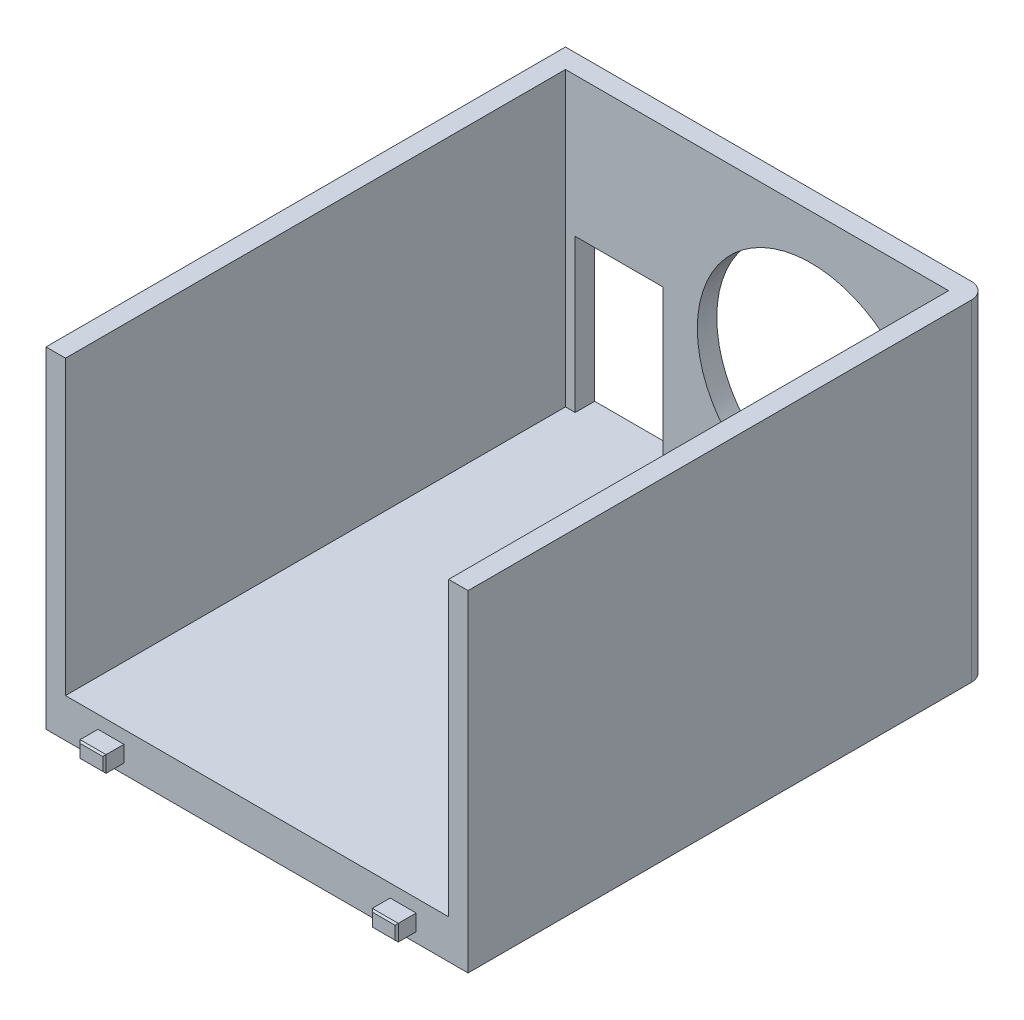
ISO-10303-21;
HEADER;
FILE_DESCRIPTION(('STEP AP214'),'2;1');
FILE_NAME('part.step','',(''),(''),'','','');
FILE_SCHEMA(('AUTOMOTIVE_DESIGN { 1 0 10303 214 1 1 1 1 }'));
ENDSEC;
DATA;
#1=APPLICATION_CONTEXT('core data for automotive mechanical design processes');
#2=APPLICATION_PROTOCOL_DEFINITION('international standard','automotive_design',2000,#1);
#3=PRODUCT_CONTEXT('',#1,'mechanical');
#4=PRODUCT('Part','Part','',(#3));
#5=PRODUCT_RELATED_PRODUCT_CATEGORY('part','',(#4));
#6=PRODUCT_DEFINITION_FORMATION('','',#4);
#7=PRODUCT_DEFINITION_CONTEXT('part definition',#1,'design');
#8=PRODUCT_DEFINITION('design','',#6,#7);
#9=PRODUCT_DEFINITION_SHAPE('','',#8);
#10=(LENGTH_UNIT() NAMED_UNIT(*) SI_UNIT(.MILLI.,.METRE.));
#11=(NAMED_UNIT(*) PLANE_ANGLE_UNIT() SI_UNIT($,.RADIAN.));
#12=(NAMED_UNIT(*) SI_UNIT($,.STERADIAN.) SOLID_ANGLE_UNIT());
#13=UNCERTAINTY_MEASURE_WITH_UNIT(LENGTH_MEASURE(1.E-05),#10,'distance_accuracy_value','');
#14=(GEOMETRIC_REPRESENTATION_CONTEXT(3) GLOBAL_UNCERTAINTY_ASSIGNED_CONTEXT((#13)) GLOBAL_UNIT_ASSIGNED_CONTEXT((#10,
#11,#12)) REPRESENTATION_CONTEXT('',''));
#15=CARTESIAN_POINT('',(0.,0.,0.));
#16=DIRECTION('',(0.,0.,1.));
#17=DIRECTION('',(1.,0.,0.));
#18=AXIS2_PLACEMENT_3D('',#15,#16,#17);
#19=CARTESIAN_POINT('',(9.,20.,90.));
#20=DIRECTION('',(-1.,0.,0.));
#21=DIRECTION('',(0.,-1.,0.));
#22=AXIS2_PLACEMENT_3D('',#19,#20,#21);
#23=PLANE('',#22);
#24=DIRECTION('',(0.,0.,-1.));
#25=VECTOR('',#24,1.);
#26=CARTESIAN_POINT('',(9.,59.,34.1602556806575));
#27=LINE('',#26,#25);
#28=CARTESIAN_POINT('',(9.,59.,6.));
#29=VERTEX_POINT('',#28);
#30=CARTESIAN_POINT('',(9.,59.,0.));
#31=VERTEX_POINT('',#30);
#32=EDGE_CURVE('E228',#29,#31,#27,.T.);
#33=ORIENTED_EDGE('',*,*,#32,.F.);
#34=DIRECTION('',(0.,1.,0.));
#35=VECTOR('',#34,1.);
#36=CARTESIAN_POINT('',(9.00000000000001,102.,6.));
#37=LINE('',#36,#35);
#38=CARTESIAN_POINT('',(9.,12.,6.));
#39=VERTEX_POINT('',#38);
#40=EDGE_CURVE('E261',#39,#29,#37,.T.);
#41=ORIENTED_EDGE('',*,*,#40,.F.);
#42=DIRECTION('',(0.,0.,-1.));
#43=VECTOR('',#42,1.);
#44=CARTESIAN_POINT('',(9.,12.,10.));
#45=LINE('',#44,#43);
#46=CARTESIAN_POINT('',(9.,12.,0.));
#47=VERTEX_POINT('',#46);
#48=EDGE_CURVE('E247',#39,#47,#45,.T.);
#49=ORIENTED_EDGE('',*,*,#48,.T.);
#50=DIRECTION('',(0.,1.,0.));
#51=VECTOR('',#50,1.);
#52=CARTESIAN_POINT('',(9.,20.,0.));
#53=LINE('',#52,#51);
#54=EDGE_CURVE('E245',#47,#31,#53,.T.);
#55=ORIENTED_EDGE('',*,*,#54,.T.);
#56=EDGE_LOOP('',(#33,#41,#49,#55));
#57=FACE_BOUND('',#56,.T.);
#58=ADVANCED_FACE('F41',(#57),#23,.F.);
#59=CARTESIAN_POINT('',(0.,12.,0.));
#60=DIRECTION('',(0.,0.,1.));
#61=DIRECTION('',(1.,0.,0.));
#62=AXIS2_PLACEMENT_3D('',#59,#60,#61);
#63=PLANE('',#62);
#64=DIRECTION('',(0.,-1.,0.));
#65=VECTOR('',#64,1.);
#66=CARTESIAN_POINT('',(36.,67.,0.));
#67=LINE('',#66,#65);
#68=CARTESIAN_POINT('',(36.,59.,0.));
#69=VERTEX_POINT('',#68);
#70=CARTESIAN_POINT('',(36.,12.,0.));
#71=VERTEX_POINT('',#70);
#72=EDGE_CURVE('E243',#69,#71,#67,.T.);
#73=ORIENTED_EDGE('',*,*,#72,.F.);
#74=DIRECTION('',(-1.,0.,0.));
#75=VECTOR('',#74,1.);
#76=CARTESIAN_POINT('',(36.,59.,0.));
#77=LINE('',#76,#75);
#78=EDGE_CURVE('E57',#69,#31,#77,.T.);
#79=ORIENTED_EDGE('',*,*,#78,.T.);
#80=ORIENTED_EDGE('',*,*,#54,.F.);
#81=DIRECTION('',(-1.,0.,0.));
#82=VECTOR('',#81,1.);
#83=CARTESIAN_POINT('',(36.,12.,0.));
#84=LINE('',#83,#82);
#85=EDGE_CURVE('E556',#71,#47,#84,.T.);
#86=ORIENTED_EDGE('',*,*,#85,.F.);
#87=EDGE_LOOP('',(#73,#79,#80,#86));
#88=FACE_BOUND('',#87,.T.);
#89=DIRECTION('',(-1.,0.,0.));
#90=VECTOR('',#89,1.);
#91=CARTESIAN_POINT('',(0.,102.,0.));
#92=LINE('',#91,#90);
#93=CARTESIAN_POINT('',(125.,102.,0.));
#94=VERTEX_POINT('',#93);
#95=CARTESIAN_POINT('',(0.,102.,0.));
#96=VERTEX_POINT('',#95);
#97=EDGE_CURVE('E295',#94,#96,#92,.T.);
#98=ORIENTED_EDGE('',*,*,#97,.F.);
#99=DIRECTION('',(0.,-1.,0.));
#100=VECTOR('',#99,1.);
#101=CARTESIAN_POINT('',(125.,12.,0.));
#102=LINE('',#101,#100);
#103=CARTESIAN_POINT('',(125.,0.,0.));
#104=VERTEX_POINT('',#103);
#105=EDGE_CURVE('E343',#94,#104,#102,.T.);
#106=ORIENTED_EDGE('',*,*,#105,.T.);
#107=DIRECTION('',(-1.,0.,0.));
#108=VECTOR('',#107,1.);
#109=CARTESIAN_POINT('',(0.,0.,0.));
#110=LINE('',#109,#108);
#111=CARTESIAN_POINT('',(0.,0.,0.));
#112=VERTEX_POINT('',#111);
#113=EDGE_CURVE('E291',#104,#112,#110,.T.);
#114=ORIENTED_EDGE('',*,*,#113,.T.);
#115=DIRECTION('',(0.,-1.,0.));
#116=VECTOR('',#115,1.);
#117=CARTESIAN_POINT('',(0.,12.,0.));
#118=LINE('',#117,#116);
#119=EDGE_CURVE('E509',#96,#112,#118,.T.);
#120=ORIENTED_EDGE('',*,*,#119,.F.);
#121=EDGE_LOOP('',(#98,#106,#114,#120));
#122=FACE_BOUND('',#121,.T.);
#123=CARTESIAN_POINT('',(81.5989299169716,53.2029572000968,0.));
#124=DIRECTION('',(0.,0.,-1.));
#125=DIRECTION('',(-1.,0.,0.));
#126=AXIS2_PLACEMENT_3D('',#123,#124,#125);
#127=CIRCLE('',#126,35.);
#128=CARTESIAN_POINT('',(46.5989299169716,53.2029572000968,0.));
#129=VERTEX_POINT('',#128);
#130=EDGE_CURVE('E249',#129,#129,#127,.T.);
#131=ORIENTED_EDGE('',*,*,#130,.F.);
#132=EDGE_LOOP('',(#131));
#133=FACE_BOUND('',#132,.T.);
#134=ADVANCED_FACE('F238',(#88,#122,#133),#63,.F.);
#135=CARTESIAN_POINT('',(0.,0.,160.));
#136=DIRECTION('',(0.,0.,1.));
#137=DIRECTION('',(1.,0.,0.));
#138=AXIS2_PLACEMENT_3D('',#135,#136,#137);
#139=PLANE('',#138);
#140=DIRECTION('',(-1.,0.,0.));
#141=VECTOR('',#140,1.);
#142=CARTESIAN_POINT('',(24.,8.,160.));
#143=LINE('',#142,#141);
#144=CARTESIAN_POINT('',(24.,8.,160.));
#145=VERTEX_POINT('',#144);
#146=CARTESIAN_POINT('',(16.,8.,160.));
#147=VERTEX_POINT('',#146);
#148=EDGE_CURVE('E522',#145,#147,#143,.T.);
#149=ORIENTED_EDGE('',*,*,#148,.F.);
#150=DIRECTION('',(0.,1.,0.));
#151=VECTOR('',#150,1.);
#152=CARTESIAN_POINT('',(24.,8.,160.));
#153=LINE('',#152,#151);
#154=CARTESIAN_POINT('',(24.,3.,160.));
#155=VERTEX_POINT('',#154);
#156=EDGE_CURVE('E550',#155,#145,#153,.T.);
#157=ORIENTED_EDGE('',*,*,#156,.F.);
#158=DIRECTION('',(1.,0.,0.));
#159=VECTOR('',#158,1.);
#160=CARTESIAN_POINT('',(16.,3.,160.));
#161=LINE('',#160,#159);
#162=CARTESIAN_POINT('',(16.,3.,160.));
#163=VERTEX_POINT('',#162);
#164=EDGE_CURVE('E549',#163,#155,#161,.T.);
#165=ORIENTED_EDGE('',*,*,#164,.F.);
#166=DIRECTION('',(0.,-1.,0.));
#167=VECTOR('',#166,1.);
#168=CARTESIAN_POINT('',(16.,8.,160.));
#169=LINE('',#168,#167);
#170=EDGE_CURVE('E554',#147,#163,#169,.T.);
#171=ORIENTED_EDGE('',*,*,#170,.F.);
#172=EDGE_LOOP('',(#149,#157,#165,#171));
#173=FACE_BOUND('',#172,.T.);
#174=DIRECTION('',(-1.,0.,0.));
#175=VECTOR('',#174,1.);
#176=CARTESIAN_POINT('',(114.,8.,160.));
#177=LINE('',#176,#175);
#178=CARTESIAN_POINT('',(114.,8.,160.));
#179=VERTEX_POINT('',#178);
#180=CARTESIAN_POINT('',(106.,8.,160.));
#181=VERTEX_POINT('',#180);
#182=EDGE_CURVE('E518',#179,#181,#177,.T.);
#183=ORIENTED_EDGE('',*,*,#182,.F.);
#184=DIRECTION('',(0.,1.,0.));
#185=VECTOR('',#184,1.);
#186=CARTESIAN_POINT('',(114.,3.,160.));
#187=LINE('',#186,#185);
#188=CARTESIAN_POINT('',(114.,3.,160.));
#189=VERTEX_POINT('',#188);
#190=EDGE_CURVE('E529',#189,#179,#187,.T.);
#191=ORIENTED_EDGE('',*,*,#190,.F.);
#192=DIRECTION('',(1.,0.,0.));
#193=VECTOR('',#192,1.);
#194=CARTESIAN_POINT('',(106.,3.,160.));
#195=LINE('',#194,#193);
#196=CARTESIAN_POINT('',(106.,3.,160.));
#197=VERTEX_POINT('',#196);
#198=EDGE_CURVE('E527',#197,#189,#195,.T.);
#199=ORIENTED_EDGE('',*,*,#198,.F.);
#200=DIRECTION('',(0.,-1.,0.));
#201=VECTOR('',#200,1.);
#202=CARTESIAN_POINT('',(106.,8.,160.));
#203=LINE('',#202,#201);
#204=EDGE_CURVE('E523',#181,#197,#203,.T.);
#205=ORIENTED_EDGE('',*,*,#204,.F.);
#206=EDGE_LOOP('',(#183,#191,#199,#205));
#207=FACE_BOUND('',#206,.T.);
#208=DIRECTION('',(0.,1.,0.));
#209=VECTOR('',#208,1.);
#210=CARTESIAN_POINT('',(130.,12.,160.));
#211=LINE('',#210,#209);
#212=CARTESIAN_POINT('',(130.,0.,160.));
#213=VERTEX_POINT('',#212);
#214=CARTESIAN_POINT('',(130.,102.,160.));
#215=VERTEX_POINT('',#214);
#216=EDGE_CURVE('E271',#213,#215,#211,.T.);
#217=ORIENTED_EDGE('',*,*,#216,.T.);
#218=DIRECTION('',(-1.,0.,0.));
#219=VECTOR('',#218,1.);
#220=CARTESIAN_POINT('',(0.,102.,160.));
#221=LINE('',#220,#219);
#222=CARTESIAN_POINT('',(124.,102.,160.));
#223=VERTEX_POINT('',#222);
#224=EDGE_CURVE('E280',#215,#223,#221,.T.);
#225=ORIENTED_EDGE('',*,*,#224,.T.);
#226=DIRECTION('',(0.,-1.,0.));
#227=VECTOR('',#226,1.);
#228=CARTESIAN_POINT('',(124.,102.,160.));
#229=LINE('',#228,#227);
#230=CARTESIAN_POINT('',(124.,12.,160.));
#231=VERTEX_POINT('',#230);
#232=EDGE_CURVE('E273',#223,#231,#229,.T.);
#233=ORIENTED_EDGE('',*,*,#232,.T.);
#234=DIRECTION('',(-1.,0.,0.));
#235=VECTOR('',#234,1.);
#236=CARTESIAN_POINT('',(0.,12.,160.));
#237=LINE('',#236,#235);
#238=CARTESIAN_POINT('',(5.99999999999999,12.,160.));
#239=VERTEX_POINT('',#238);
#240=EDGE_CURVE('E265',#231,#239,#237,.T.);
#241=ORIENTED_EDGE('',*,*,#240,.T.);
#242=DIRECTION('',(0.,1.,0.));
#243=VECTOR('',#242,1.);
#244=CARTESIAN_POINT('',(5.99999999999999,102.,160.));
#245=LINE('',#244,#243);
#246=CARTESIAN_POINT('',(5.99999999999999,102.,160.));
#247=VERTEX_POINT('',#246);
#248=EDGE_CURVE('E264',#239,#247,#245,.T.);
#249=ORIENTED_EDGE('',*,*,#248,.T.);
#250=CARTESIAN_POINT('',(0.,102.,160.));
#251=VERTEX_POINT('',#250);
#252=EDGE_CURVE('E279',#247,#251,#221,.T.);
#253=ORIENTED_EDGE('',*,*,#252,.T.);
#254=DIRECTION('',(0.,-1.,0.));
#255=VECTOR('',#254,1.);
#256=CARTESIAN_POINT('',(0.,12.,160.));
#257=LINE('',#256,#255);
#258=CARTESIAN_POINT('',(0.,0.,160.));
#259=VERTEX_POINT('',#258);
#260=EDGE_CURVE('E268',#251,#259,#257,.T.);
#261=ORIENTED_EDGE('',*,*,#260,.T.);
#262=DIRECTION('',(-1.,0.,0.));
#263=VECTOR('',#262,1.);
#264=CARTESIAN_POINT('',(0.,0.,160.));
#265=LINE('',#264,#263);
#266=EDGE_CURVE('E259',#213,#259,#265,.T.);
#267=ORIENTED_EDGE('',*,*,#266,.F.);
#268=EDGE_LOOP('',(#217,#225,#233,#241,#249,#253,#261,#267));
#269=FACE_BOUND('',#268,.T.);
#270=ADVANCED_FACE('F435',(#173,#207,#269),#139,.T.);
#271=CARTESIAN_POINT('',(0.,12.,0.));
#272=DIRECTION('',(0.,-1.,0.));
#273=DIRECTION('',(0.,0.,-1.));
#274=AXIS2_PLACEMENT_3D('',#271,#272,#273);
#275=PLANE('',#274);
#276=DIRECTION('',(1.,0.,0.));
#277=VECTOR('',#276,1.);
#278=CARTESIAN_POINT('',(124.,12.,5.99999999999999));
#279=LINE('',#278,#277);
#280=CARTESIAN_POINT('',(36.,12.,6.));
#281=VERTEX_POINT('',#280);
#282=CARTESIAN_POINT('',(124.,12.,5.99999999999999));
#283=VERTEX_POINT('',#282);
#284=EDGE_CURVE('E413',#281,#283,#279,.T.);
#285=ORIENTED_EDGE('',*,*,#284,.F.);
#286=DIRECTION('',(0.,0.,-1.));
#287=VECTOR('',#286,1.);
#288=CARTESIAN_POINT('',(36.,12.,10.));
#289=LINE('',#288,#287);
#290=EDGE_CURVE('E508',#281,#71,#289,.T.);
#291=ORIENTED_EDGE('',*,*,#290,.T.);
#292=ORIENTED_EDGE('',*,*,#85,.T.);
#293=ORIENTED_EDGE('',*,*,#48,.F.);
#294=CARTESIAN_POINT('',(5.99999999999999,12.,6.));
#295=VERTEX_POINT('',#294);
#296=EDGE_CURVE('E415',#295,#39,#279,.T.);
#297=ORIENTED_EDGE('',*,*,#296,.F.);
#298=DIRECTION('',(0.,0.,-1.));
#299=VECTOR('',#298,1.);
#300=CARTESIAN_POINT('',(5.99999999999997,12.,0.));
#301=LINE('',#300,#299);
#302=EDGE_CURVE('E296',#239,#295,#301,.T.);
#303=ORIENTED_EDGE('',*,*,#302,.F.);
#304=ORIENTED_EDGE('',*,*,#240,.F.);
#305=DIRECTION('',(0.,0.,1.));
#306=VECTOR('',#305,1.);
#307=CARTESIAN_POINT('',(124.,12.,0.));
#308=LINE('',#307,#306);
#309=EDGE_CURVE('E301',#283,#231,#308,.T.);
#310=ORIENTED_EDGE('',*,*,#309,.F.);
#311=EDGE_LOOP('',(#285,#291,#292,#293,#297,#303,#304,#310));
#312=FACE_BOUND('',#311,.T.);
#313=ADVANCED_FACE('F428',(#312),#275,.F.);
#314=CARTESIAN_POINT('',(5.99999999999997,102.,0.));
#315=DIRECTION('',(-1.,0.,0.));
#316=DIRECTION('',(0.,0.,1.));
#317=AXIS2_PLACEMENT_3D('',#314,#315,#316);
#318=PLANE('',#317);
#319=ORIENTED_EDGE('',*,*,#248,.F.);
#320=ORIENTED_EDGE('',*,*,#302,.T.);
#321=DIRECTION('',(0.,-1.,0.));
#322=VECTOR('',#321,1.);
#323=CARTESIAN_POINT('',(5.99999999999999,102.,6.));
#324=LINE('',#323,#322);
#325=CARTESIAN_POINT('',(5.99999999999997,102.,5.99999999999999));
#326=VERTEX_POINT('',#325);
#327=EDGE_CURVE('E306',#326,#295,#324,.T.);
#328=ORIENTED_EDGE('',*,*,#327,.F.);
#329=DIRECTION('',(0.,0.,-1.));
#330=VECTOR('',#329,1.);
#331=CARTESIAN_POINT('',(5.99999999999997,102.,0.));
#332=LINE('',#331,#330);
#333=EDGE_CURVE('E294',#247,#326,#332,.T.);
#334=ORIENTED_EDGE('',*,*,#333,.F.);
#335=EDGE_LOOP('',(#319,#320,#328,#334));
#336=FACE_BOUND('',#335,.T.);
#337=ADVANCED_FACE('F497',(#336),#318,.F.);
#338=CARTESIAN_POINT('',(0.,12.,250.));
#339=DIRECTION('',(1.,0.,0.));
#340=DIRECTION('',(0.,0.,-1.));
#341=AXIS2_PLACEMENT_3D('',#338,#339,#340);
#342=PLANE('',#341);
#343=ORIENTED_EDGE('',*,*,#260,.F.);
#344=DIRECTION('',(0.,0.,1.));
#345=VECTOR('',#344,1.);
#346=CARTESIAN_POINT('',(0.,102.,320.));
#347=LINE('',#346,#345);
#348=EDGE_CURVE('E289',#96,#251,#347,.T.);
#349=ORIENTED_EDGE('',*,*,#348,.F.);
#350=ORIENTED_EDGE('',*,*,#119,.T.);
#351=DIRECTION('',(0.,0.,1.));
#352=VECTOR('',#351,1.);
#353=CARTESIAN_POINT('',(0.,0.,0.));
#354=LINE('',#353,#352);
#355=CARTESIAN_POINT('',(0.,0.,70.));
#356=VERTEX_POINT('',#355);
#357=EDGE_CURVE('E386',#112,#356,#354,.T.);
#358=ORIENTED_EDGE('',*,*,#357,.T.);
#359=DIRECTION('',(0.,-1.,0.));
#360=VECTOR('',#359,1.);
#361=CARTESIAN_POINT('',(0.,12.,70.));
#362=LINE('',#361,#360);
#363=CARTESIAN_POINT('',(0.,12.,70.));
#364=VERTEX_POINT('',#363);
#365=EDGE_CURVE('E459',#364,#356,#362,.T.);
#366=ORIENTED_EDGE('',*,*,#365,.F.);
#367=DIRECTION('',(0.,0.,1.));
#368=VECTOR('',#367,1.);
#369=CARTESIAN_POINT('',(0.,12.,320.));
#370=LINE('',#369,#368);
#371=CARTESIAN_POINT('',(0.,12.,90.));
#372=VERTEX_POINT('',#371);
#373=EDGE_CURVE('E297',#364,#372,#370,.T.);
#374=ORIENTED_EDGE('',*,*,#373,.T.);
#375=DIRECTION('',(0.,-1.,0.));
#376=VECTOR('',#375,1.);
#377=CARTESIAN_POINT('',(0.,12.,90.));
#378=LINE('',#377,#376);
#379=CARTESIAN_POINT('',(0.,0.,90.));
#380=VERTEX_POINT('',#379);
#381=EDGE_CURVE('E399',#372,#380,#378,.T.);
#382=ORIENTED_EDGE('',*,*,#381,.T.);
#383=DIRECTION('',(0.,0.,1.));
#384=VECTOR('',#383,1.);
#385=CARTESIAN_POINT('',(0.,0.,90.));
#386=LINE('',#385,#384);
#387=EDGE_CURVE('E283',#380,#259,#386,.T.);
#388=ORIENTED_EDGE('',*,*,#387,.T.);
#389=EDGE_LOOP('',(#343,#349,#350,#358,#366,#374,#382,#388));
#390=FACE_BOUND('',#389,.T.);
#391=ADVANCED_FACE('F439',(#390),#342,.F.);
#392=CARTESIAN_POINT('',(130.,12.,0.));
#393=DIRECTION('',(-1.,0.,0.));
#394=DIRECTION('',(0.,0.,1.));
#395=AXIS2_PLACEMENT_3D('',#392,#393,#394);
#396=PLANE('',#395);
#397=DIRECTION('',(0.,0.,-1.));
#398=VECTOR('',#397,1.);
#399=CARTESIAN_POINT('',(130.,0.,0.));
#400=LINE('',#399,#398);
#401=CARTESIAN_POINT('',(130.,0.,5.));
#402=VERTEX_POINT('',#401);
#403=EDGE_CURVE('E284',#213,#402,#400,.T.);
#404=ORIENTED_EDGE('',*,*,#403,.T.);
#405=DIRECTION('',(0.,-1.,0.));
#406=VECTOR('',#405,1.);
#407=CARTESIAN_POINT('',(130.,12.,5.));
#408=LINE('',#407,#406);
#409=CARTESIAN_POINT('',(130.,102.,5.));
#410=VERTEX_POINT('',#409);
#411=EDGE_CURVE('E47',#402,#410,#408,.F.);
#412=ORIENTED_EDGE('',*,*,#411,.T.);
#413=DIRECTION('',(0.,0.,-1.));
#414=VECTOR('',#413,1.);
#415=CARTESIAN_POINT('',(130.,102.,320.));
#416=LINE('',#415,#414);
#417=EDGE_CURVE('E302',#215,#410,#416,.T.);
#418=ORIENTED_EDGE('',*,*,#417,.F.);
#419=ORIENTED_EDGE('',*,*,#216,.F.);
#420=EDGE_LOOP('',(#404,#412,#418,#419));
#421=FACE_BOUND('',#420,.T.);
#422=ADVANCED_FACE('F371',(#421),#396,.F.);
#423=CARTESIAN_POINT('',(0.,0.,0.));
#424=DIRECTION('',(0.,-1.,0.));
#425=DIRECTION('',(0.,0.,-1.));
#426=AXIS2_PLACEMENT_3D('',#423,#424,#425);
#427=PLANE('',#426);
#428=ORIENTED_EDGE('',*,*,#113,.F.);
#429=CARTESIAN_POINT('',(125.,0.,5.));
#430=DIRECTION('',(0.,-1.,0.));
#431=DIRECTION('',(0.,0.,-1.));
#432=AXIS2_PLACEMENT_3D('',#429,#430,#431);
#433=CIRCLE('',#432,5.);
#434=EDGE_CURVE('E366',#104,#402,#433,.T.);
#435=ORIENTED_EDGE('',*,*,#434,.T.);
#436=ORIENTED_EDGE('',*,*,#403,.F.);
#437=ORIENTED_EDGE('',*,*,#266,.T.);
#438=ORIENTED_EDGE('',*,*,#387,.F.);
#439=DIRECTION('',(-1.,0.,0.));
#440=VECTOR('',#439,1.);
#441=CARTESIAN_POINT('',(4.00000000000001,0.,90.));
#442=LINE('',#441,#440);
#443=CARTESIAN_POINT('',(4.00000000000001,0.,90.));
#444=VERTEX_POINT('',#443);
#445=EDGE_CURVE('E288',#444,#380,#442,.T.);
#446=ORIENTED_EDGE('',*,*,#445,.F.);
#447=DIRECTION('',(0.,0.,1.));
#448=VECTOR('',#447,1.);
#449=CARTESIAN_POINT('',(4.00000000000001,0.,70.));
#450=LINE('',#449,#448);
#451=CARTESIAN_POINT('',(4.00000000000001,0.,70.));
#452=VERTEX_POINT('',#451);
#453=EDGE_CURVE('E455',#452,#444,#450,.T.);
#454=ORIENTED_EDGE('',*,*,#453,.F.);
#455=DIRECTION('',(1.,0.,0.));
#456=VECTOR('',#455,1.);
#457=CARTESIAN_POINT('',(0.,0.,70.));
#458=LINE('',#457,#456);
#459=EDGE_CURVE('E394',#356,#452,#458,.T.);
#460=ORIENTED_EDGE('',*,*,#459,.F.);
#461=ORIENTED_EDGE('',*,*,#357,.F.);
#462=EDGE_LOOP('',(#428,#435,#436,#437,#438,#446,#454,#460,#461));
#463=FACE_BOUND('',#462,.T.);
#464=ADVANCED_FACE('F390',(#463),#427,.T.);
#465=CARTESIAN_POINT('',(124.,102.,0.));
#466=DIRECTION('',(1.,0.,0.));
#467=DIRECTION('',(0.,0.,-1.));
#468=AXIS2_PLACEMENT_3D('',#465,#466,#467);
#469=PLANE('',#468);
#470=ORIENTED_EDGE('',*,*,#232,.F.);
#471=DIRECTION('',(0.,0.,1.));
#472=VECTOR('',#471,1.);
#473=CARTESIAN_POINT('',(124.,102.,0.));
#474=LINE('',#473,#472);
#475=CARTESIAN_POINT('',(124.,102.,5.99999999999999));
#476=VERTEX_POINT('',#475);
#477=EDGE_CURVE('E308',#476,#223,#474,.T.);
#478=ORIENTED_EDGE('',*,*,#477,.F.);
#479=DIRECTION('',(0.,-1.,0.));
#480=VECTOR('',#479,1.);
#481=CARTESIAN_POINT('',(124.,102.,5.99999999999999));
#482=LINE('',#481,#480);
#483=EDGE_CURVE('E410',#476,#283,#482,.T.);
#484=ORIENTED_EDGE('',*,*,#483,.T.);
#485=ORIENTED_EDGE('',*,*,#309,.T.);
#486=EDGE_LOOP('',(#470,#478,#484,#485));
#487=FACE_BOUND('',#486,.T.);
#488=ADVANCED_FACE('F426',(#487),#469,.F.);
#489=CARTESIAN_POINT('',(0.,102.,0.));
#490=DIRECTION('',(0.,-1.,0.));
#491=DIRECTION('',(0.,0.,-1.));
#492=AXIS2_PLACEMENT_3D('',#489,#490,#491);
#493=PLANE('',#492);
#494=ORIENTED_EDGE('',*,*,#417,.T.);
#495=CARTESIAN_POINT('',(125.,102.,5.));
#496=DIRECTION('',(0.,-1.,0.));
#497=DIRECTION('',(0.,0.,-1.));
#498=AXIS2_PLACEMENT_3D('',#495,#496,#497);
#499=CIRCLE('',#498,5.);
#500=EDGE_CURVE('E11',#410,#94,#499,.F.);
#501=ORIENTED_EDGE('',*,*,#500,.T.);
#502=ORIENTED_EDGE('',*,*,#97,.T.);
#503=ORIENTED_EDGE('',*,*,#348,.T.);
#504=ORIENTED_EDGE('',*,*,#252,.F.);
#505=ORIENTED_EDGE('',*,*,#333,.T.);
#506=DIRECTION('',(1.,0.,0.));
#507=VECTOR('',#506,1.);
#508=CARTESIAN_POINT('',(124.,102.,5.99999999999999));
#509=LINE('',#508,#507);
#510=EDGE_CURVE('E411',#326,#476,#509,.T.);
#511=ORIENTED_EDGE('',*,*,#510,.T.);
#512=ORIENTED_EDGE('',*,*,#477,.T.);
#513=ORIENTED_EDGE('',*,*,#224,.F.);
#514=EDGE_LOOP('',(#494,#501,#502,#503,#504,#505,#511,#512,#513));
#515=FACE_BOUND('',#514,.T.);
#516=ADVANCED_FACE('F378',(#515),#493,.F.);
#517=CARTESIAN_POINT('',(0.,12.,70.));
#518=DIRECTION('',(0.,0.,-1.));
#519=DIRECTION('',(-1.,0.,0.));
#520=AXIS2_PLACEMENT_3D('',#517,#518,#519);
#521=PLANE('',#520);
#522=ORIENTED_EDGE('',*,*,#459,.T.);
#523=DIRECTION('',(0.,-1.,0.));
#524=VECTOR('',#523,1.);
#525=CARTESIAN_POINT('',(4.00000000000001,12.,70.));
#526=LINE('',#525,#524);
#527=CARTESIAN_POINT('',(4.00000000000001,12.,70.));
#528=VERTEX_POINT('',#527);
#529=EDGE_CURVE('E449',#528,#452,#526,.T.);
#530=ORIENTED_EDGE('',*,*,#529,.F.);
#531=DIRECTION('',(1.,0.,0.));
#532=VECTOR('',#531,1.);
#533=CARTESIAN_POINT('',(0.,12.,70.));
#534=LINE('',#533,#532);
#535=EDGE_CURVE('E286',#364,#528,#534,.T.);
#536=ORIENTED_EDGE('',*,*,#535,.F.);
#537=ORIENTED_EDGE('',*,*,#365,.T.);
#538=EDGE_LOOP('',(#522,#530,#536,#537));
#539=FACE_BOUND('',#538,.T.);
#540=ADVANCED_FACE('F457',(#539),#521,.F.);
#541=CARTESIAN_POINT('',(4.00000000000001,12.,70.));
#542=DIRECTION('',(1.,0.,0.));
#543=DIRECTION('',(0.,0.,-1.));
#544=AXIS2_PLACEMENT_3D('',#541,#542,#543);
#545=PLANE('',#544);
#546=ORIENTED_EDGE('',*,*,#453,.T.);
#547=DIRECTION('',(0.,-1.,0.));
#548=VECTOR('',#547,1.);
#549=CARTESIAN_POINT('',(4.00000000000001,12.,90.));
#550=LINE('',#549,#548);
#551=CARTESIAN_POINT('',(4.00000000000001,12.,90.));
#552=VERTEX_POINT('',#551);
#553=EDGE_CURVE('E441',#552,#444,#550,.T.);
#554=ORIENTED_EDGE('',*,*,#553,.F.);
#555=DIRECTION('',(0.,0.,1.));
#556=VECTOR('',#555,1.);
#557=CARTESIAN_POINT('',(4.00000000000001,12.,70.));
#558=LINE('',#557,#556);
#559=EDGE_CURVE('E398',#528,#552,#558,.T.);
#560=ORIENTED_EDGE('',*,*,#559,.F.);
#561=ORIENTED_EDGE('',*,*,#529,.T.);
#562=EDGE_LOOP('',(#546,#554,#560,#561));
#563=FACE_BOUND('',#562,.T.);
#564=ADVANCED_FACE('F464',(#563),#545,.F.);
#565=CARTESIAN_POINT('',(4.00000000000001,12.,90.));
#566=DIRECTION('',(0.,0.,1.));
#567=DIRECTION('',(1.,0.,0.));
#568=AXIS2_PLACEMENT_3D('',#565,#566,#567);
#569=PLANE('',#568);
#570=ORIENTED_EDGE('',*,*,#445,.T.);
#571=ORIENTED_EDGE('',*,*,#381,.F.);
#572=DIRECTION('',(-1.,0.,0.));
#573=VECTOR('',#572,1.);
#574=CARTESIAN_POINT('',(4.00000000000001,12.,90.));
#575=LINE('',#574,#573);
#576=EDGE_CURVE('E396',#552,#372,#575,.T.);
#577=ORIENTED_EDGE('',*,*,#576,.F.);
#578=ORIENTED_EDGE('',*,*,#553,.T.);
#579=EDGE_LOOP('',(#570,#571,#577,#578));
#580=FACE_BOUND('',#579,.T.);
#581=ADVANCED_FACE('F465',(#580),#569,.F.);
#582=CARTESIAN_POINT('',(0.,12.,0.));
#583=DIRECTION('',(0.,-1.,0.));
#584=DIRECTION('',(0.,0.,-1.));
#585=AXIS2_PLACEMENT_3D('',#582,#583,#584);
#586=PLANE('',#585);
#587=ORIENTED_EDGE('',*,*,#373,.F.);
#588=ORIENTED_EDGE('',*,*,#535,.T.);
#589=ORIENTED_EDGE('',*,*,#559,.T.);
#590=ORIENTED_EDGE('',*,*,#576,.T.);
#591=EDGE_LOOP('',(#587,#588,#589,#590));
#592=FACE_BOUND('',#591,.T.);
#593=ADVANCED_FACE('F463',(#592),#586,.T.);
#594=CARTESIAN_POINT('',(124.,102.,5.99999999999999));
#595=DIRECTION('',(0.,0.,-1.));
#596=DIRECTION('',(-1.,0.,0.));
#597=AXIS2_PLACEMENT_3D('',#594,#595,#596);
#598=PLANE('',#597);
#599=ORIENTED_EDGE('',*,*,#40,.T.);
#600=DIRECTION('',(1.,0.,0.));
#601=VECTOR('',#600,1.);
#602=CARTESIAN_POINT('',(36.,59.,5.99999999999999));
#603=LINE('',#602,#601);
#604=CARTESIAN_POINT('',(36.,59.,5.99999999999999));
#605=VERTEX_POINT('',#604);
#606=EDGE_CURVE('E235',#29,#605,#603,.T.);
#607=ORIENTED_EDGE('',*,*,#606,.T.);
#608=DIRECTION('',(0.,-1.,0.));
#609=VECTOR('',#608,1.);
#610=CARTESIAN_POINT('',(36.,102.,6.));
#611=LINE('',#610,#609);
#612=EDGE_CURVE('E61',#605,#281,#611,.T.);
#613=ORIENTED_EDGE('',*,*,#612,.T.);
#614=ORIENTED_EDGE('',*,*,#284,.T.);
#615=ORIENTED_EDGE('',*,*,#483,.F.);
#616=ORIENTED_EDGE('',*,*,#510,.F.);
#617=ORIENTED_EDGE('',*,*,#327,.T.);
#618=ORIENTED_EDGE('',*,*,#296,.T.);
#619=EDGE_LOOP('',(#599,#607,#613,#614,#615,#616,#617,#618));
#620=FACE_BOUND('',#619,.T.);
#621=CARTESIAN_POINT('',(81.5989299169716,53.2029572000968,6.00000000000001));
#622=DIRECTION('',(0.,0.,-1.));
#623=DIRECTION('',(-1.,0.,0.));
#624=AXIS2_PLACEMENT_3D('',#621,#622,#623);
#625=CIRCLE('',#624,35.);
#626=CARTESIAN_POINT('',(46.5989299169716,53.2029572000968,6.00000000000002));
#627=VERTEX_POINT('',#626);
#628=EDGE_CURVE('E254',#627,#627,#625,.T.);
#629=ORIENTED_EDGE('',*,*,#628,.T.);
#630=EDGE_LOOP('',(#629));
#631=FACE_BOUND('',#630,.T.);
#632=ADVANCED_FACE('F420',(#620,#631),#598,.F.);
#633=CARTESIAN_POINT('',(81.5989299169716,53.2029572000968,90.));
#634=DIRECTION('',(0.,0.,-1.));
#635=DIRECTION('',(-1.,0.,0.));
#636=AXIS2_PLACEMENT_3D('',#633,#634,#635);
#637=CYLINDRICAL_SURFACE('',#636,35.);
#638=CARTESIAN_POINT('',(46.5989299169716,53.2029572000968,0.));
#639=CARTESIAN_POINT('',(46.5989299169716,53.2029572000968,0.0625000000000163));
#640=CARTESIAN_POINT('',(46.5989299169716,53.2029572000968,0.125000000000019));
#641=CARTESIAN_POINT('',(46.5989299169716,53.2029572000968,0.250000000000019));
#642=CARTESIAN_POINT('',(46.5989299169716,53.2029572000968,0.312500000000016));
#643=CARTESIAN_POINT('',(46.5989299169716,53.2029572000968,0.437500000000012));
#644=CARTESIAN_POINT('',(46.5989299169716,53.2029572000968,0.50000000000001));
#645=CARTESIAN_POINT('',(46.5989299169716,53.2029572000968,0.62500000000001));
#646=CARTESIAN_POINT('',(46.5989299169716,53.2029572000968,0.687500000000012));
#647=CARTESIAN_POINT('',(46.5989299169716,53.2029572000968,0.812500000000017));
#648=CARTESIAN_POINT('',(46.5989299169716,53.2029572000968,0.875000000000019));
#649=CARTESIAN_POINT('',(46.5989299169716,53.2029572000968,1.00000000000002));
#650=CARTESIAN_POINT('',(46.5989299169716,53.2029572000968,1.06250000000002));
#651=CARTESIAN_POINT('',(46.5989299169716,53.2029572000968,1.18750000000001));
#652=CARTESIAN_POINT('',(46.5989299169716,53.2029572000968,1.25000000000001));
#653=CARTESIAN_POINT('',(46.5989299169716,53.2029572000968,1.37500000000001));
#654=CARTESIAN_POINT('',(46.5989299169716,53.2029572000968,1.43750000000001));
#655=CARTESIAN_POINT('',(46.5989299169716,53.2029572000968,1.56250000000002));
#656=CARTESIAN_POINT('',(46.5989299169716,53.2029572000968,1.62500000000002));
#657=CARTESIAN_POINT('',(46.5989299169716,53.2029572000968,1.75000000000002));
#658=CARTESIAN_POINT('',(46.5989299169716,53.2029572000968,1.81250000000002));
#659=CARTESIAN_POINT('',(46.5989299169716,53.2029572000968,1.93750000000001));
#660=CARTESIAN_POINT('',(46.5989299169716,53.2029572000968,2.00000000000001));
#661=CARTESIAN_POINT('',(46.5989299169716,53.2029572000968,2.12500000000001));
#662=CARTESIAN_POINT('',(46.5989299169716,53.2029572000968,2.18750000000001));
#663=CARTESIAN_POINT('',(46.5989299169716,53.2029572000968,2.31250000000002));
#664=CARTESIAN_POINT('',(46.5989299169716,53.2029572000968,2.37500000000002));
#665=CARTESIAN_POINT('',(46.5989299169716,53.2029572000968,2.50000000000002));
#666=CARTESIAN_POINT('',(46.5989299169716,53.2029572000968,2.56250000000002));
#667=CARTESIAN_POINT('',(46.5989299169716,53.2029572000968,2.68750000000001));
#668=CARTESIAN_POINT('',(46.5989299169716,53.2029572000968,2.75000000000001));
#669=CARTESIAN_POINT('',(46.5989299169716,53.2029572000968,2.87500000000001));
#670=CARTESIAN_POINT('',(46.5989299169716,53.2029572000968,2.93750000000001));
#671=CARTESIAN_POINT('',(46.5989299169716,53.2029572000968,3.06250000000002));
#672=CARTESIAN_POINT('',(46.5989299169716,53.2029572000968,3.12500000000002));
#673=CARTESIAN_POINT('',(46.5989299169716,53.2029572000968,3.25000000000002));
#674=CARTESIAN_POINT('',(46.5989299169716,53.2029572000968,3.31250000000002));
#675=CARTESIAN_POINT('',(46.5989299169716,53.2029572000968,3.43750000000001));
#676=CARTESIAN_POINT('',(46.5989299169716,53.2029572000968,3.50000000000001));
#677=CARTESIAN_POINT('',(46.5989299169716,53.2029572000968,3.62500000000001));
#678=CARTESIAN_POINT('',(46.5989299169716,53.2029572000968,3.68750000000002));
#679=CARTESIAN_POINT('',(46.5989299169716,53.2029572000968,3.81250000000002));
#680=CARTESIAN_POINT('',(46.5989299169716,53.2029572000968,3.87500000000002));
#681=CARTESIAN_POINT('',(46.5989299169716,53.2029572000968,4.00000000000002));
#682=CARTESIAN_POINT('',(46.5989299169716,53.2029572000968,4.06250000000002));
#683=CARTESIAN_POINT('',(46.5989299169716,53.2029572000968,4.18750000000002));
#684=CARTESIAN_POINT('',(46.5989299169716,53.2029572000968,4.25000000000001));
#685=CARTESIAN_POINT('',(46.5989299169716,53.2029572000968,4.37500000000001));
#686=CARTESIAN_POINT('',(46.5989299169716,53.2029572000968,4.43750000000002));
#687=CARTESIAN_POINT('',(46.5989299169716,53.2029572000968,4.56250000000002));
#688=CARTESIAN_POINT('',(46.5989299169716,53.2029572000968,4.62500000000002));
#689=CARTESIAN_POINT('',(46.5989299169716,53.2029572000968,4.75000000000002));
#690=CARTESIAN_POINT('',(46.5989299169716,53.2029572000968,4.81250000000002));
#691=CARTESIAN_POINT('',(46.5989299169716,53.2029572000968,4.93750000000002));
#692=CARTESIAN_POINT('',(46.5989299169716,53.2029572000968,5.00000000000001));
#693=CARTESIAN_POINT('',(46.5989299169716,53.2029572000968,5.12500000000001));
#694=CARTESIAN_POINT('',(46.5989299169716,53.2029572000968,5.18750000000002));
#695=CARTESIAN_POINT('',(46.5989299169716,53.2029572000968,5.31250000000002));
#696=CARTESIAN_POINT('',(46.5989299169716,53.2029572000968,5.37500000000002));
#697=CARTESIAN_POINT('',(46.5989299169716,53.2029572000968,5.50000000000002));
#698=CARTESIAN_POINT('',(46.5989299169716,53.2029572000968,5.56250000000002));
#699=CARTESIAN_POINT('',(46.5989299169716,53.2029572000968,5.68750000000002));
#700=CARTESIAN_POINT('',(46.5989299169716,53.2029572000968,5.75000000000001));
#701=CARTESIAN_POINT('',(46.5989299169716,53.2029572000968,5.87500000000002));
#702=CARTESIAN_POINT('',(46.5989299169716,53.2029572000968,5.93750000000002));
#703=CARTESIAN_POINT('',(46.5989299169716,53.2029572000968,6.00000000000002));
#704=B_SPLINE_CURVE_WITH_KNOTS('',3,(#638,#639,#640,#641,#642,#643,#644,#645,#646,#647,#648,
#649,#650,#651,#652,#653,#654,#655,#656,#657,#658,#659,#660,#661,#662,#663,#664,#665,#666,#667,
#668,#669,#670,#671,#672,#673,#674,#675,#676,#677,#678,#679,#680,#681,#682,#683,#684,#685,#686,
#687,#688,#689,#690,#691,#692,#693,#694,#695,#696,#697,#698,#699,#700,#701,#702,#703),
.UNSPECIFIED.,.F.,.F.,(4,2,2,2,2,2,2,2,2,2,2,2,2,2,2,2,2,2,2,2,2,2,2,2,2,2,2,2,2,2,2,2,4),(0.,
0.187500000000007,0.375,0.562499999999994,0.750000000000001,0.937500000000008,1.125,
1.31249999999999,1.5,1.68750000000001,1.875,2.06249999999999,2.25,2.43750000000001,2.625,2.8125,
3.,3.18750000000001,3.375,3.5625,3.75,3.93750000000001,4.125,4.3125,4.5,4.68750000000001,4.875,
5.0625,5.25,5.43750000000001,5.62500000000001,5.8125,6.00000000000001),.UNSPECIFIED.);
#705=EDGE_CURVE('BSEAM475',#129,#627,#704,.T.);
#706=ORIENTED_EDGE('',*,*,#130,.T.);
#707=ORIENTED_EDGE('',*,*,#628,.F.);
#708=ORIENTED_EDGE('',*,*,#705,.T.);
#709=ORIENTED_EDGE('',*,*,#705,.F.);
#710=EDGE_LOOP('',(#706,#708,#707,#709));
#711=FACE_BOUND('',#710,.T.);
#712=ADVANCED_FACE('F475',(#711),#637,.F.);
#713=CARTESIAN_POINT('',(36.,67.,90.));
#714=DIRECTION('',(1.,0.,0.));
#715=DIRECTION('',(0.,1.,0.));
#716=AXIS2_PLACEMENT_3D('',#713,#714,#715);
#717=PLANE('',#716);
#718=ORIENTED_EDGE('',*,*,#612,.F.);
#719=DIRECTION('',(0.,0.,-1.));
#720=VECTOR('',#719,1.);
#721=CARTESIAN_POINT('',(36.,59.,34.1602556806575));
#722=LINE('',#721,#720);
#723=EDGE_CURVE('E237',#605,#69,#722,.T.);
#724=ORIENTED_EDGE('',*,*,#723,.T.);
#725=ORIENTED_EDGE('',*,*,#72,.T.);
#726=ORIENTED_EDGE('',*,*,#290,.F.);
#727=EDGE_LOOP('',(#718,#724,#725,#726));
#728=FACE_BOUND('',#727,.T.);
#729=ADVANCED_FACE('F490',(#728),#717,.F.);
#730=CARTESIAN_POINT('',(114.,8.,166.));
#731=DIRECTION('',(0.,-1.,0.));
#732=DIRECTION('',(1.,0.,0.));
#733=AXIS2_PLACEMENT_3D('',#730,#731,#732);
#734=PLANE('',#733);
#735=DIRECTION('',(0.,0.,-1.));
#736=VECTOR('',#735,1.);
#737=CARTESIAN_POINT('',(106.,8.,166.));
#738=LINE('',#737,#736);
#739=CARTESIAN_POINT('',(106.,8.,165.5));
#740=VERTEX_POINT('',#739);
#741=EDGE_CURVE('E356',#740,#181,#738,.T.);
#742=ORIENTED_EDGE('',*,*,#741,.F.);
#743=DIRECTION('',(1.,0.,0.));
#744=VECTOR('',#743,1.);
#745=CARTESIAN_POINT('',(114.,8.,165.5));
#746=LINE('',#745,#744);
#747=CARTESIAN_POINT('',(114.,8.,165.5));
#748=VERTEX_POINT('',#747);
#749=EDGE_CURVE('E322',#740,#748,#746,.T.);
#750=ORIENTED_EDGE('',*,*,#749,.T.);
#751=DIRECTION('',(0.,0.,-1.));
#752=VECTOR('',#751,1.);
#753=CARTESIAN_POINT('',(114.,8.,166.));
#754=LINE('',#753,#752);
#755=EDGE_CURVE('E531',#748,#179,#754,.T.);
#756=ORIENTED_EDGE('',*,*,#755,.T.);
#757=ORIENTED_EDGE('',*,*,#182,.T.);
#758=EDGE_LOOP('',(#742,#750,#756,#757));
#759=FACE_BOUND('',#758,.T.);
#760=ADVANCED_FACE('F491',(#759),#734,.F.);
#761=CARTESIAN_POINT('',(106.,8.,166.));
#762=DIRECTION('',(1.,0.,0.));
#763=DIRECTION('',(0.,1.,0.));
#764=AXIS2_PLACEMENT_3D('',#761,#762,#763);
#765=PLANE('',#764);
#766=DIRECTION('',(0.,0.,-1.));
#767=VECTOR('',#766,1.);
#768=CARTESIAN_POINT('',(106.,3.,166.));
#769=LINE('',#768,#767);
#770=CARTESIAN_POINT('',(106.,3.,165.5));
#771=VERTEX_POINT('',#770);
#772=EDGE_CURVE('E540',#771,#197,#769,.T.);
#773=ORIENTED_EDGE('',*,*,#772,.F.);
#774=DIRECTION('',(0.,1.,0.));
#775=VECTOR('',#774,1.);
#776=CARTESIAN_POINT('',(106.,8.,165.5));
#777=LINE('',#776,#775);
#778=EDGE_CURVE('E320',#771,#740,#777,.T.);
#779=ORIENTED_EDGE('',*,*,#778,.T.);
#780=ORIENTED_EDGE('',*,*,#741,.T.);
#781=ORIENTED_EDGE('',*,*,#204,.T.);
#782=EDGE_LOOP('',(#773,#779,#780,#781));
#783=FACE_BOUND('',#782,.T.);
#784=ADVANCED_FACE('F496',(#783),#765,.F.);
#785=CARTESIAN_POINT('',(106.,3.,166.));
#786=DIRECTION('',(0.,1.,0.));
#787=DIRECTION('',(0.,0.,1.));
#788=AXIS2_PLACEMENT_3D('',#785,#786,#787);
#789=PLANE('',#788);
#790=DIRECTION('',(0.,0.,-1.));
#791=VECTOR('',#790,1.);
#792=CARTESIAN_POINT('',(114.,3.,166.));
#793=LINE('',#792,#791);
#794=CARTESIAN_POINT('',(114.,3.,165.5));
#795=VERTEX_POINT('',#794);
#796=EDGE_CURVE('E532',#795,#189,#793,.T.);
#797=ORIENTED_EDGE('',*,*,#796,.F.);
#798=DIRECTION('',(-1.,0.,0.));
#799=VECTOR('',#798,1.);
#800=CARTESIAN_POINT('',(106.,3.,165.5));
#801=LINE('',#800,#799);
#802=EDGE_CURVE('E319',#795,#771,#801,.T.);
#803=ORIENTED_EDGE('',*,*,#802,.T.);
#804=ORIENTED_EDGE('',*,*,#772,.T.);
#805=ORIENTED_EDGE('',*,*,#198,.T.);
#806=EDGE_LOOP('',(#797,#803,#804,#805));
#807=FACE_BOUND('',#806,.T.);
#808=ADVANCED_FACE('F683',(#807),#789,.F.);
#809=CARTESIAN_POINT('',(114.,3.,166.));
#810=DIRECTION('',(-1.,0.,0.));
#811=DIRECTION('',(0.,0.,1.));
#812=AXIS2_PLACEMENT_3D('',#809,#810,#811);
#813=PLANE('',#812);
#814=ORIENTED_EDGE('',*,*,#755,.F.);
#815=DIRECTION('',(0.,-1.,0.));
#816=VECTOR('',#815,1.);
#817=CARTESIAN_POINT('',(114.,3.,165.5));
#818=LINE('',#817,#816);
#819=EDGE_CURVE('E325',#748,#795,#818,.T.);
#820=ORIENTED_EDGE('',*,*,#819,.T.);
#821=ORIENTED_EDGE('',*,*,#796,.T.);
#822=ORIENTED_EDGE('',*,*,#190,.T.);
#823=EDGE_LOOP('',(#814,#820,#821,#822));
#824=FACE_BOUND('',#823,.T.);
#825=ADVANCED_FACE('F688',(#824),#813,.F.);
#826=CARTESIAN_POINT('',(0.,0.,166.));
#827=DIRECTION('',(0.,0.,1.));
#828=DIRECTION('',(1.,0.,0.));
#829=AXIS2_PLACEMENT_3D('',#826,#827,#828);
#830=PLANE('',#829);
#831=DIRECTION('',(-1.,0.,0.));
#832=VECTOR('',#831,1.);
#833=CARTESIAN_POINT('',(106.,7.49999999999997,166.));
#834=LINE('',#833,#832);
#835=CARTESIAN_POINT('',(113.5,7.49999999999998,166.));
#836=VERTEX_POINT('',#835);
#837=CARTESIAN_POINT('',(106.5,7.49999999999997,166.));
#838=VERTEX_POINT('',#837);
#839=EDGE_CURVE('E252',#836,#838,#834,.T.);
#840=ORIENTED_EDGE('',*,*,#839,.T.);
#841=DIRECTION('',(0.,-1.,0.));
#842=VECTOR('',#841,1.);
#843=CARTESIAN_POINT('',(106.5,3.,166.));
#844=LINE('',#843,#842);
#845=CARTESIAN_POINT('',(106.5,3.50000000000003,166.));
#846=VERTEX_POINT('',#845);
#847=EDGE_CURVE('E314',#838,#846,#844,.T.);
#848=ORIENTED_EDGE('',*,*,#847,.T.);
#849=DIRECTION('',(1.,0.,0.));
#850=VECTOR('',#849,1.);
#851=CARTESIAN_POINT('',(114.,3.50000000000003,166.));
#852=LINE('',#851,#850);
#853=CARTESIAN_POINT('',(113.5,3.50000000000003,166.));
#854=VERTEX_POINT('',#853);
#855=EDGE_CURVE('E315',#846,#854,#852,.T.);
#856=ORIENTED_EDGE('',*,*,#855,.T.);
#857=DIRECTION('',(0.,1.,0.));
#858=VECTOR('',#857,1.);
#859=CARTESIAN_POINT('',(113.5,8.,166.));
#860=LINE('',#859,#858);
#861=EDGE_CURVE('E309',#854,#836,#860,.T.);
#862=ORIENTED_EDGE('',*,*,#861,.T.);
#863=EDGE_LOOP('',(#840,#848,#856,#862));
#864=FACE_BOUND('',#863,.T.);
#865=ADVANCED_FACE('F682',(#864),#830,.T.);
#866=CARTESIAN_POINT('',(24.,8.,166.));
#867=DIRECTION('',(0.,-1.,0.));
#868=DIRECTION('',(0.,0.,-1.));
#869=AXIS2_PLACEMENT_3D('',#866,#867,#868);
#870=PLANE('',#869);
#871=DIRECTION('',(0.,0.,-1.));
#872=VECTOR('',#871,1.);
#873=CARTESIAN_POINT('',(16.,8.,166.));
#874=LINE('',#873,#872);
#875=CARTESIAN_POINT('',(16.,8.,165.5));
#876=VERTEX_POINT('',#875);
#877=EDGE_CURVE('E282',#876,#147,#874,.T.);
#878=ORIENTED_EDGE('',*,*,#877,.F.);
#879=DIRECTION('',(1.,0.,0.));
#880=VECTOR('',#879,1.);
#881=CARTESIAN_POINT('',(24.,8.,165.5));
#882=LINE('',#881,#880);
#883=CARTESIAN_POINT('',(24.,8.,165.5));
#884=VERTEX_POINT('',#883);
#885=EDGE_CURVE('E345',#876,#884,#882,.T.);
#886=ORIENTED_EDGE('',*,*,#885,.T.);
#887=DIRECTION('',(0.,0.,-1.));
#888=VECTOR('',#887,1.);
#889=CARTESIAN_POINT('',(24.,8.,166.));
#890=LINE('',#889,#888);
#891=EDGE_CURVE('E544',#884,#145,#890,.T.);
#892=ORIENTED_EDGE('',*,*,#891,.T.);
#893=ORIENTED_EDGE('',*,*,#148,.T.);
#894=EDGE_LOOP('',(#878,#886,#892,#893));
#895=FACE_BOUND('',#894,.T.);
#896=ADVANCED_FACE('F664',(#895),#870,.F.);
#897=CARTESIAN_POINT('',(16.,8.,166.));
#898=DIRECTION('',(1.,0.,0.));
#899=DIRECTION('',(0.,0.,-1.));
#900=AXIS2_PLACEMENT_3D('',#897,#898,#899);
#901=PLANE('',#900);
#902=DIRECTION('',(0.,0.,-1.));
#903=VECTOR('',#902,1.);
#904=CARTESIAN_POINT('',(16.,3.,166.));
#905=LINE('',#904,#903);
#906=CARTESIAN_POINT('',(16.,3.,165.5));
#907=VERTEX_POINT('',#906);
#908=EDGE_CURVE('E541',#907,#163,#905,.T.);
#909=ORIENTED_EDGE('',*,*,#908,.F.);
#910=DIRECTION('',(0.,1.,0.));
#911=VECTOR('',#910,1.);
#912=CARTESIAN_POINT('',(16.,8.,165.5));
#913=LINE('',#912,#911);
#914=EDGE_CURVE('E333',#907,#876,#913,.T.);
#915=ORIENTED_EDGE('',*,*,#914,.T.);
#916=ORIENTED_EDGE('',*,*,#877,.T.);
#917=ORIENTED_EDGE('',*,*,#170,.T.);
#918=EDGE_LOOP('',(#909,#915,#916,#917));
#919=FACE_BOUND('',#918,.T.);
#920=ADVANCED_FACE('F652',(#919),#901,.F.);
#921=CARTESIAN_POINT('',(16.,3.,166.));
#922=DIRECTION('',(0.,1.,0.));
#923=DIRECTION('',(-1.,0.,0.));
#924=AXIS2_PLACEMENT_3D('',#921,#922,#923);
#925=PLANE('',#924);
#926=DIRECTION('',(0.,0.,-1.));
#927=VECTOR('',#926,1.);
#928=CARTESIAN_POINT('',(24.,3.,166.));
#929=LINE('',#928,#927);
#930=CARTESIAN_POINT('',(24.,3.,165.5));
#931=VERTEX_POINT('',#930);
#932=EDGE_CURVE('E543',#931,#155,#929,.T.);
#933=ORIENTED_EDGE('',*,*,#932,.F.);
#934=DIRECTION('',(-1.,0.,0.));
#935=VECTOR('',#934,1.);
#936=CARTESIAN_POINT('',(16.,3.,165.5));
#937=LINE('',#936,#935);
#938=EDGE_CURVE('E340',#931,#907,#937,.T.);
#939=ORIENTED_EDGE('',*,*,#938,.T.);
#940=ORIENTED_EDGE('',*,*,#908,.T.);
#941=ORIENTED_EDGE('',*,*,#164,.T.);
#942=EDGE_LOOP('',(#933,#939,#940,#941));
#943=FACE_BOUND('',#942,.T.);
#944=ADVANCED_FACE('F649',(#943),#925,.F.);
#945=CARTESIAN_POINT('',(24.,8.,166.));
#946=DIRECTION('',(-1.,0.,0.));
#947=DIRECTION('',(0.,0.,1.));
#948=AXIS2_PLACEMENT_3D('',#945,#946,#947);
#949=PLANE('',#948);
#950=ORIENTED_EDGE('',*,*,#891,.F.);
#951=DIRECTION('',(0.,-1.,0.));
#952=VECTOR('',#951,1.);
#953=CARTESIAN_POINT('',(24.,3.,165.5));
#954=LINE('',#953,#952);
#955=EDGE_CURVE('E338',#884,#931,#954,.T.);
#956=ORIENTED_EDGE('',*,*,#955,.T.);
#957=ORIENTED_EDGE('',*,*,#932,.T.);
#958=ORIENTED_EDGE('',*,*,#156,.T.);
#959=EDGE_LOOP('',(#950,#956,#957,#958));
#960=FACE_BOUND('',#959,.T.);
#961=ADVANCED_FACE('F663',(#960),#949,.F.);
#962=CARTESIAN_POINT('',(0.,0.,166.));
#963=DIRECTION('',(0.,0.,1.));
#964=DIRECTION('',(1.,0.,0.));
#965=AXIS2_PLACEMENT_3D('',#962,#963,#964);
#966=PLANE('',#965);
#967=DIRECTION('',(-1.,0.,0.));
#968=VECTOR('',#967,1.);
#969=CARTESIAN_POINT('',(16.,7.49999999999997,166.));
#970=LINE('',#969,#968);
#971=CARTESIAN_POINT('',(23.5,7.49999999999997,166.));
#972=VERTEX_POINT('',#971);
#973=CARTESIAN_POINT('',(16.5,7.49999999999997,166.));
#974=VERTEX_POINT('',#973);
#975=EDGE_CURVE('E326',#972,#974,#970,.T.);
#976=ORIENTED_EDGE('',*,*,#975,.T.);
#977=DIRECTION('',(0.,-1.,0.));
#978=VECTOR('',#977,1.);
#979=CARTESIAN_POINT('',(16.5,3.,166.));
#980=LINE('',#979,#978);
#981=CARTESIAN_POINT('',(16.5,3.50000000000003,166.));
#982=VERTEX_POINT('',#981);
#983=EDGE_CURVE('E335',#974,#982,#980,.T.);
#984=ORIENTED_EDGE('',*,*,#983,.T.);
#985=DIRECTION('',(1.,0.,0.));
#986=VECTOR('',#985,1.);
#987=CARTESIAN_POINT('',(24.,3.50000000000003,166.));
#988=LINE('',#987,#986);
#989=CARTESIAN_POINT('',(23.5,3.50000000000003,166.));
#990=VERTEX_POINT('',#989);
#991=EDGE_CURVE('E329',#982,#990,#988,.T.);
#992=ORIENTED_EDGE('',*,*,#991,.T.);
#993=DIRECTION('',(0.,1.,0.));
#994=VECTOR('',#993,1.);
#995=CARTESIAN_POINT('',(23.5,8.,166.));
#996=LINE('',#995,#994);
#997=EDGE_CURVE('E327',#990,#972,#996,.T.);
#998=ORIENTED_EDGE('',*,*,#997,.T.);
#999=EDGE_LOOP('',(#976,#984,#992,#998));
#1000=FACE_BOUND('',#999,.T.);
#1001=ADVANCED_FACE('F614',(#1000),#966,.T.);
#1002=CARTESIAN_POINT('',(113.5,0.,166.));
#1003=DIRECTION('',(0.707106781186528,0.,0.707106781186567));
#1004=DIRECTION('',(0.,-1.,0.));
#1005=AXIS2_PLACEMENT_3D('',#1002,#1003,#1004);
#1006=PLANE('',#1005);
#1007=DIRECTION('',(0.577350269189637,-0.577350269189637,-0.577350269189604));
#1008=VECTOR('',#1007,1.);
#1009=CARTESIAN_POINT('',(114.666666666667,2.33333333333331,164.833333333333));
#1010=LINE('',#1009,#1008);
#1011=EDGE_CURVE('E348',#795,#854,#1010,.F.);
#1012=ORIENTED_EDGE('',*,*,#1011,.F.);
#1013=ORIENTED_EDGE('',*,*,#819,.F.);
#1014=DIRECTION('',(0.577350269189636,0.577350269189637,-0.577350269189604));
#1015=VECTOR('',#1014,1.);
#1016=CARTESIAN_POINT('',(75.6666666666653,-30.3333333333348,203.833333333333));
#1017=LINE('',#1016,#1015);
#1018=EDGE_CURVE('E355',#836,#748,#1017,.T.);
#1019=ORIENTED_EDGE('',*,*,#1018,.F.);
#1020=ORIENTED_EDGE('',*,*,#861,.F.);
#1021=EDGE_LOOP('',(#1012,#1013,#1019,#1020));
#1022=FACE_BOUND('',#1021,.T.);
#1023=ADVANCED_FACE('F607',(#1022),#1006,.T.);
#1024=CARTESIAN_POINT('',(0.,7.49999999999993,166.));
#1025=DIRECTION('',(0.,0.707106781186528,0.707106781186567));
#1026=DIRECTION('',(1.,0.,0.));
#1027=AXIS2_PLACEMENT_3D('',#1024,#1025,#1026);
#1028=PLANE('',#1027);
#1029=ORIENTED_EDGE('',*,*,#1018,.T.);
#1030=ORIENTED_EDGE('',*,*,#749,.F.);
#1031=DIRECTION('',(0.577350269189631,-0.577350269189639,0.577350269189607));
#1032=VECTOR('',#1031,1.);
#1033=CARTESIAN_POINT('',(70.9999999999994,43.0000000000011,130.500000000001));
#1034=LINE('',#1033,#1032);
#1035=EDGE_CURVE('E350',#838,#740,#1034,.F.);
#1036=ORIENTED_EDGE('',*,*,#1035,.F.);
#1037=ORIENTED_EDGE('',*,*,#839,.F.);
#1038=EDGE_LOOP('',(#1029,#1030,#1036,#1037));
#1039=FACE_BOUND('',#1038,.T.);
#1040=ADVANCED_FACE('F597',(#1039),#1028,.T.);
#1041=CARTESIAN_POINT('',(0.,3.50000000000003,166.));
#1042=DIRECTION('',(0.,-0.707106781186528,0.707106781186567));
#1043=DIRECTION('',(-1.,0.,0.));
#1044=AXIS2_PLACEMENT_3D('',#1041,#1042,#1043);
#1045=PLANE('',#1044);
#1046=ORIENTED_EDGE('',*,*,#1011,.T.);
#1047=ORIENTED_EDGE('',*,*,#855,.F.);
#1048=DIRECTION('',(-0.577350269189633,-0.577350269189638,-0.577350269189606));
#1049=VECTOR('',#1048,1.);
#1050=CARTESIAN_POINT('',(70.9999999999991,-32.0000000000012,130.500000000001));
#1051=LINE('',#1050,#1049);
#1052=EDGE_CURVE('E344',#771,#846,#1051,.F.);
#1053=ORIENTED_EDGE('',*,*,#1052,.F.);
#1054=ORIENTED_EDGE('',*,*,#802,.F.);
#1055=EDGE_LOOP('',(#1046,#1047,#1053,#1054));
#1056=FACE_BOUND('',#1055,.T.);
#1057=ADVANCED_FACE('F595',(#1056),#1045,.T.);
#1058=CARTESIAN_POINT('',(106.5,-2.95596880306448E-13,166.));
#1059=DIRECTION('',(-0.707106781186532,0.,0.707106781186563));
#1060=DIRECTION('',(0.,1.,0.));
#1061=AXIS2_PLACEMENT_3D('',#1058,#1059,#1060);
#1062=PLANE('',#1061);
#1063=ORIENTED_EDGE('',*,*,#1035,.T.);
#1064=ORIENTED_EDGE('',*,*,#778,.F.);
#1065=ORIENTED_EDGE('',*,*,#1052,.T.);
#1066=ORIENTED_EDGE('',*,*,#847,.F.);
#1067=EDGE_LOOP('',(#1063,#1064,#1065,#1066));
#1068=FACE_BOUND('',#1067,.T.);
#1069=ADVANCED_FACE('F585',(#1068),#1062,.T.);
#1070=CARTESIAN_POINT('',(23.5,0.,166.));
#1071=DIRECTION('',(0.707106781186528,0.,0.707106781186567));
#1072=DIRECTION('',(0.,-1.,0.));
#1073=AXIS2_PLACEMENT_3D('',#1070,#1071,#1072);
#1074=PLANE('',#1073);
#1075=DIRECTION('',(0.577350269189637,-0.577350269189637,-0.577350269189604));
#1076=VECTOR('',#1075,1.);
#1077=CARTESIAN_POINT('',(24.6666666666667,2.33333333333331,164.833333333333));
#1078=LINE('',#1077,#1076);
#1079=EDGE_CURVE('E363',#931,#990,#1078,.F.);
#1080=ORIENTED_EDGE('',*,*,#1079,.F.);
#1081=ORIENTED_EDGE('',*,*,#955,.F.);
#1082=DIRECTION('',(0.577350269189637,0.577350269189637,-0.577350269189604));
#1083=VECTOR('',#1082,1.);
#1084=CARTESIAN_POINT('',(15.6666666666664,-0.333333333333644,173.833333333333));
#1085=LINE('',#1084,#1083);
#1086=EDGE_CURVE('E346',#972,#884,#1085,.T.);
#1087=ORIENTED_EDGE('',*,*,#1086,.F.);
#1088=ORIENTED_EDGE('',*,*,#997,.F.);
#1089=EDGE_LOOP('',(#1080,#1081,#1087,#1088));
#1090=FACE_BOUND('',#1089,.T.);
#1091=ADVANCED_FACE('F591',(#1090),#1074,.T.);
#1092=CARTESIAN_POINT('',(0.,7.49999999999997,166.));
#1093=DIRECTION('',(0.,0.707106781186528,0.707106781186567));
#1094=DIRECTION('',(1.,0.,0.));
#1095=AXIS2_PLACEMENT_3D('',#1092,#1093,#1094);
#1096=PLANE('',#1095);
#1097=ORIENTED_EDGE('',*,*,#1086,.T.);
#1098=ORIENTED_EDGE('',*,*,#885,.F.);
#1099=DIRECTION('',(0.577350269189637,-0.577350269189637,0.577350269189604));
#1100=VECTOR('',#1099,1.);
#1101=CARTESIAN_POINT('',(10.9999999999998,13.0000000000002,160.5));
#1102=LINE('',#1101,#1100);
#1103=EDGE_CURVE('E358',#974,#876,#1102,.F.);
#1104=ORIENTED_EDGE('',*,*,#1103,.F.);
#1105=ORIENTED_EDGE('',*,*,#975,.F.);
#1106=EDGE_LOOP('',(#1097,#1098,#1104,#1105));
#1107=FACE_BOUND('',#1106,.T.);
#1108=ADVANCED_FACE('F630',(#1107),#1096,.T.);
#1109=CARTESIAN_POINT('',(0.,3.50000000000003,166.));
#1110=DIRECTION('',(0.,-0.707106781186528,0.707106781186567));
#1111=DIRECTION('',(-1.,0.,0.));
#1112=AXIS2_PLACEMENT_3D('',#1109,#1110,#1111);
#1113=PLANE('',#1112);
#1114=ORIENTED_EDGE('',*,*,#1079,.T.);
#1115=ORIENTED_EDGE('',*,*,#991,.F.);
#1116=DIRECTION('',(-0.577350269189637,-0.577350269189637,-0.577350269189604));
#1117=VECTOR('',#1116,1.);
#1118=CARTESIAN_POINT('',(10.9999999999998,-2.00000000000019,160.5));
#1119=LINE('',#1118,#1117);
#1120=EDGE_CURVE('E360',#907,#982,#1119,.F.);
#1121=ORIENTED_EDGE('',*,*,#1120,.F.);
#1122=ORIENTED_EDGE('',*,*,#938,.F.);
#1123=EDGE_LOOP('',(#1114,#1115,#1121,#1122));
#1124=FACE_BOUND('',#1123,.T.);
#1125=ADVANCED_FACE('F622',(#1124),#1113,.T.);
#1126=CARTESIAN_POINT('',(16.5,0.,166.));
#1127=DIRECTION('',(-0.707106781186528,0.,0.707106781186567));
#1128=DIRECTION('',(0.,1.,0.));
#1129=AXIS2_PLACEMENT_3D('',#1126,#1127,#1128);
#1130=PLANE('',#1129);
#1131=ORIENTED_EDGE('',*,*,#1103,.T.);
#1132=ORIENTED_EDGE('',*,*,#914,.F.);
#1133=ORIENTED_EDGE('',*,*,#1120,.T.);
#1134=ORIENTED_EDGE('',*,*,#983,.F.);
#1135=EDGE_LOOP('',(#1131,#1132,#1133,#1134));
#1136=FACE_BOUND('',#1135,.T.);
#1137=ADVANCED_FACE('F613',(#1136),#1130,.T.);
#1138=CARTESIAN_POINT('',(125.,12.,5.));
#1139=DIRECTION('',(0.,-1.,0.));
#1140=DIRECTION('',(0.,0.,-1.));
#1141=AXIS2_PLACEMENT_3D('',#1138,#1139,#1140);
#1142=CYLINDRICAL_SURFACE('',#1141,5.);
#1143=ORIENTED_EDGE('',*,*,#500,.F.);
#1144=ORIENTED_EDGE('',*,*,#411,.F.);
#1145=ORIENTED_EDGE('',*,*,#434,.F.);
#1146=ORIENTED_EDGE('',*,*,#105,.F.);
#1147=EDGE_LOOP('',(#1143,#1144,#1145,#1146));
#1148=FACE_BOUND('',#1147,.T.);
#1149=ADVANCED_FACE('F43',(#1148),#1142,.T.);
#1150=CARTESIAN_POINT('',(36.,59.,34.1602556806575));
#1151=DIRECTION('',(0.,-1.,0.));
#1152=DIRECTION('',(1.,0.,0.));
#1153=AXIS2_PLACEMENT_3D('',#1150,#1151,#1152);
#1154=PLANE('',#1153);
#1155=ORIENTED_EDGE('',*,*,#606,.F.);
#1156=ORIENTED_EDGE('',*,*,#32,.T.);
#1157=ORIENTED_EDGE('',*,*,#78,.F.);
#1158=ORIENTED_EDGE('',*,*,#723,.F.);
#1159=EDGE_LOOP('',(#1155,#1156,#1157,#1158));
#1160=FACE_BOUND('',#1159,.T.);
#1161=ADVANCED_FACE('F231',(#1160),#1154,.T.);
#1162=CLOSED_SHELL('',(#58,#134,#270,#313,#337,#391,#422,#464,#488,#516,#540,#564,#581,#593,
#632,#712,#729,#760,#784,#808,#825,#865,#896,#920,#944,#961,#1001,#1023,#1040,#1057,#1069,#1091,
#1108,#1125,#1137,#1149,#1161));
#1163=MANIFOLD_SOLID_BREP('B2',#1162);
#1164=ADVANCED_BREP_SHAPE_REPRESENTATION('',(#18,#1163),#14);
#1165=SHAPE_DEFINITION_REPRESENTATION(#9,#1164);
ENDSEC;
END-ISO-10303-21;
